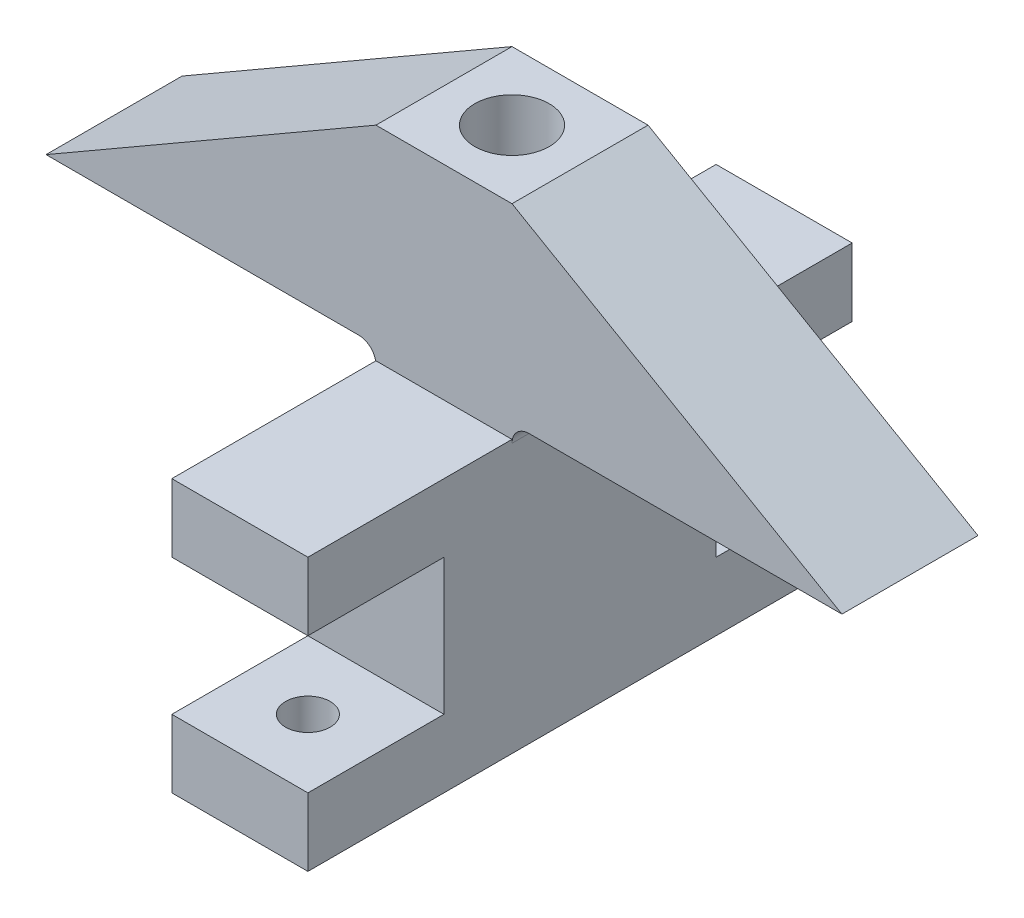
ISO-10303-21;
HEADER;
FILE_DESCRIPTION(('STEP AP214'),'2;1');
FILE_NAME('part.step','',(''),(''),'','','');
FILE_SCHEMA(('AUTOMOTIVE_DESIGN { 1 0 10303 214 1 1 1 1 }'));
ENDSEC;
DATA;
#1=APPLICATION_CONTEXT('core data for automotive mechanical design processes');
#2=APPLICATION_PROTOCOL_DEFINITION('international standard','automotive_design',2000,#1);
#3=PRODUCT_CONTEXT('',#1,'mechanical');
#4=PRODUCT('Part','Part','',(#3));
#5=PRODUCT_RELATED_PRODUCT_CATEGORY('part','',(#4));
#6=PRODUCT_DEFINITION_FORMATION('','',#4);
#7=PRODUCT_DEFINITION_CONTEXT('part definition',#1,'design');
#8=PRODUCT_DEFINITION('design','',#6,#7);
#9=PRODUCT_DEFINITION_SHAPE('','',#8);
#10=(LENGTH_UNIT() NAMED_UNIT(*) SI_UNIT(.MILLI.,.METRE.));
#11=(NAMED_UNIT(*) PLANE_ANGLE_UNIT() SI_UNIT($,.RADIAN.));
#12=(NAMED_UNIT(*) SI_UNIT($,.STERADIAN.) SOLID_ANGLE_UNIT());
#13=UNCERTAINTY_MEASURE_WITH_UNIT(LENGTH_MEASURE(1.E-05),#10,'distance_accuracy_value','');
#14=(GEOMETRIC_REPRESENTATION_CONTEXT(3) GLOBAL_UNCERTAINTY_ASSIGNED_CONTEXT((#13)) GLOBAL_UNIT_ASSIGNED_CONTEXT((#10,
#11,#12)) REPRESENTATION_CONTEXT('',''));
#15=CARTESIAN_POINT('',(0.,0.,0.));
#16=DIRECTION('',(0.,0.,1.));
#17=DIRECTION('',(1.,0.,0.));
#18=AXIS2_PLACEMENT_3D('',#15,#16,#17);
#19=CARTESIAN_POINT('',(0.,0.,0.));
#20=DIRECTION('',(0.,0.,-1.));
#21=DIRECTION('',(-1.,0.,0.));
#22=AXIS2_PLACEMENT_3D('',#19,#20,#21);
#23=PLANE('',#22);
#24=DIRECTION('',(-1.,0.,0.));
#25=VECTOR('',#24,1.);
#26=CARTESIAN_POINT('',(0.,50.8,0.));
#27=LINE('',#26,#25);
#28=CARTESIAN_POINT('',(25.4,50.8,0.));
#29=VERTEX_POINT('',#28);
#30=CARTESIAN_POINT('',(0.,50.8,0.));
#31=VERTEX_POINT('',#30);
#32=EDGE_CURVE('E59',#29,#31,#27,.T.);
#33=ORIENTED_EDGE('',*,*,#32,.T.);
#34=DIRECTION('',(0.,1.,0.));
#35=VECTOR('',#34,1.);
#36=CARTESIAN_POINT('',(0.,0.,0.));
#37=LINE('',#36,#35);
#38=CARTESIAN_POINT('',(0.,50.165,0.));
#39=VERTEX_POINT('',#38);
#40=EDGE_CURVE('E212',#39,#31,#37,.T.);
#41=ORIENTED_EDGE('',*,*,#40,.F.);
#42=CARTESIAN_POINT('',(-3.175,50.165,0.));
#43=DIRECTION('',(0.,0.,-1.));
#44=DIRECTION('',(-1.,0.,0.));
#45=AXIS2_PLACEMENT_3D('',#42,#43,#44);
#46=CIRCLE('',#45,3.175);
#47=CARTESIAN_POINT('',(-3.175,53.34,0.));
#48=VERTEX_POINT('',#47);
#49=EDGE_CURVE('E52',#39,#48,#46,.F.);
#50=ORIENTED_EDGE('',*,*,#49,.T.);
#51=DIRECTION('',(1.,0.,0.));
#52=VECTOR('',#51,1.);
#53=CARTESIAN_POINT('',(0.,53.34,0.));
#54=LINE('',#53,#52);
#55=CARTESIAN_POINT('',(-61.5917267171501,53.34,0.));
#56=VERTEX_POINT('',#55);
#57=EDGE_CURVE('E381',#56,#48,#54,.T.);
#58=ORIENTED_EDGE('',*,*,#57,.F.);
#59=DIRECTION('',(-0.866025403784441,-0.499999999999995,0.));
#60=VECTOR('',#59,1.);
#61=CARTESIAN_POINT('',(-61.5917267171501,53.34,0.));
#62=LINE('',#61,#60);
#63=CARTESIAN_POINT('',(0.,88.9,0.));
#64=VERTEX_POINT('',#63);
#65=EDGE_CURVE('E403',#64,#56,#62,.T.);
#66=ORIENTED_EDGE('',*,*,#65,.F.);
#67=DIRECTION('',(-1.,0.,0.));
#68=VECTOR('',#67,1.);
#69=CARTESIAN_POINT('',(0.,88.9,0.));
#70=LINE('',#69,#68);
#71=CARTESIAN_POINT('',(25.4,88.9,0.));
#72=VERTEX_POINT('',#71);
#73=EDGE_CURVE('E400',#72,#64,#70,.T.);
#74=ORIENTED_EDGE('',*,*,#73,.F.);
#75=DIRECTION('',(-0.866025403784442,0.499999999999995,0.));
#76=VECTOR('',#75,1.);
#77=CARTESIAN_POINT('',(25.4,88.9,0.));
#78=LINE('',#77,#76);
#79=CARTESIAN_POINT('',(86.9917267171501,53.34,0.));
#80=VERTEX_POINT('',#79);
#81=EDGE_CURVE('E397',#80,#72,#78,.T.);
#82=ORIENTED_EDGE('',*,*,#81,.F.);
#83=DIRECTION('',(1.,0.,0.));
#84=VECTOR('',#83,1.);
#85=CARTESIAN_POINT('',(86.9917267171501,53.34,0.));
#86=LINE('',#85,#84);
#87=CARTESIAN_POINT('',(28.575,53.34,0.));
#88=VERTEX_POINT('',#87);
#89=EDGE_CURVE('E376',#88,#80,#86,.T.);
#90=ORIENTED_EDGE('',*,*,#89,.F.);
#91=CARTESIAN_POINT('',(28.575,50.165,0.));
#92=DIRECTION('',(0.,0.,-1.));
#93=DIRECTION('',(-1.,0.,0.));
#94=AXIS2_PLACEMENT_3D('',#91,#92,#93);
#95=CIRCLE('',#94,3.175);
#96=CARTESIAN_POINT('',(25.4,50.165,0.));
#97=VERTEX_POINT('',#96);
#98=EDGE_CURVE('E444',#88,#97,#95,.F.);
#99=ORIENTED_EDGE('',*,*,#98,.T.);
#100=DIRECTION('',(0.,1.,0.));
#101=VECTOR('',#100,1.);
#102=CARTESIAN_POINT('',(25.4,0.,0.));
#103=LINE('',#102,#101);
#104=EDGE_CURVE('E64',#97,#29,#103,.T.);
#105=ORIENTED_EDGE('',*,*,#104,.T.);
#106=EDGE_LOOP('',(#33,#41,#50,#58,#66,#74,#82,#90,#99,#105));
#107=FACE_BOUND('',#106,.T.);
#108=ADVANCED_FACE('F43',(#107),#23,.T.);
#109=CARTESIAN_POINT('',(0.,0.,25.4));
#110=DIRECTION('',(0.,0.,-1.));
#111=DIRECTION('',(-1.,0.,0.));
#112=AXIS2_PLACEMENT_3D('',#109,#110,#111);
#113=PLANE('',#112);
#114=DIRECTION('',(0.,-1.,0.));
#115=VECTOR('',#114,1.);
#116=CARTESIAN_POINT('',(0.,0.,25.4));
#117=LINE('',#116,#115);
#118=CARTESIAN_POINT('',(0.,50.8,25.4));
#119=VERTEX_POINT('',#118);
#120=CARTESIAN_POINT('',(0.,50.165,25.4));
#121=VERTEX_POINT('',#120);
#122=EDGE_CURVE('E254',#119,#121,#117,.T.);
#123=ORIENTED_EDGE('',*,*,#122,.F.);
#124=DIRECTION('',(1.,0.,0.));
#125=VECTOR('',#124,1.);
#126=CARTESIAN_POINT('',(0.,50.8,25.4));
#127=LINE('',#126,#125);
#128=CARTESIAN_POINT('',(25.4,50.8,25.4));
#129=VERTEX_POINT('',#128);
#130=EDGE_CURVE('E260',#119,#129,#127,.T.);
#131=ORIENTED_EDGE('',*,*,#130,.T.);
#132=DIRECTION('',(0.,1.,0.));
#133=VECTOR('',#132,1.);
#134=CARTESIAN_POINT('',(25.4,0.,25.4));
#135=LINE('',#134,#133);
#136=CARTESIAN_POINT('',(25.4,50.165,25.4));
#137=VERTEX_POINT('',#136);
#138=EDGE_CURVE('E274',#137,#129,#135,.T.);
#139=ORIENTED_EDGE('',*,*,#138,.F.);
#140=CARTESIAN_POINT('',(28.575,50.165,25.4));
#141=DIRECTION('',(0.,0.,-1.));
#142=DIRECTION('',(-1.,0.,0.));
#143=AXIS2_PLACEMENT_3D('',#140,#141,#142);
#144=CIRCLE('',#143,3.175);
#145=CARTESIAN_POINT('',(28.575,53.34,25.4));
#146=VERTEX_POINT('',#145);
#147=EDGE_CURVE('E447',#137,#146,#144,.T.);
#148=ORIENTED_EDGE('',*,*,#147,.T.);
#149=DIRECTION('',(1.,0.,0.));
#150=VECTOR('',#149,1.);
#151=CARTESIAN_POINT('',(86.9917267171501,53.34,25.4));
#152=LINE('',#151,#150);
#153=CARTESIAN_POINT('',(86.9917267171501,53.34,25.4));
#154=VERTEX_POINT('',#153);
#155=EDGE_CURVE('E377',#146,#154,#152,.T.);
#156=ORIENTED_EDGE('',*,*,#155,.T.);
#157=DIRECTION('',(-0.866025403784442,0.499999999999995,0.));
#158=VECTOR('',#157,1.);
#159=CARTESIAN_POINT('',(25.4,88.9,25.4));
#160=LINE('',#159,#158);
#161=CARTESIAN_POINT('',(25.4,88.9,25.4));
#162=VERTEX_POINT('',#161);
#163=EDGE_CURVE('E380',#154,#162,#160,.T.);
#164=ORIENTED_EDGE('',*,*,#163,.T.);
#165=DIRECTION('',(-1.,0.,0.));
#166=VECTOR('',#165,1.);
#167=CARTESIAN_POINT('',(0.,88.9,25.4));
#168=LINE('',#167,#166);
#169=CARTESIAN_POINT('',(0.,88.9,25.4));
#170=VERTEX_POINT('',#169);
#171=EDGE_CURVE('E384',#162,#170,#168,.T.);
#172=ORIENTED_EDGE('',*,*,#171,.T.);
#173=DIRECTION('',(-0.866025403784441,-0.499999999999995,0.));
#174=VECTOR('',#173,1.);
#175=CARTESIAN_POINT('',(-61.5917267171501,53.34,25.4));
#176=LINE('',#175,#174);
#177=CARTESIAN_POINT('',(-61.5917267171501,53.34,25.4));
#178=VERTEX_POINT('',#177);
#179=EDGE_CURVE('E387',#170,#178,#176,.T.);
#180=ORIENTED_EDGE('',*,*,#179,.T.);
#181=DIRECTION('',(1.,0.,0.));
#182=VECTOR('',#181,1.);
#183=CARTESIAN_POINT('',(0.,53.34,25.4));
#184=LINE('',#183,#182);
#185=CARTESIAN_POINT('',(-3.175,53.34,25.4));
#186=VERTEX_POINT('',#185);
#187=EDGE_CURVE('E390',#178,#186,#184,.T.);
#188=ORIENTED_EDGE('',*,*,#187,.T.);
#189=CARTESIAN_POINT('',(-3.175,50.165,25.4));
#190=DIRECTION('',(0.,0.,-1.));
#191=DIRECTION('',(-1.,0.,0.));
#192=AXIS2_PLACEMENT_3D('',#189,#190,#191);
#193=CIRCLE('',#192,3.175);
#194=EDGE_CURVE('E11',#186,#121,#193,.T.);
#195=ORIENTED_EDGE('',*,*,#194,.T.);
#196=EDGE_LOOP('',(#123,#131,#139,#148,#156,#164,#172,#180,#188,#195));
#197=FACE_BOUND('',#196,.T.);
#198=ADVANCED_FACE('F462',(#197),#113,.F.);
#199=CARTESIAN_POINT('',(25.4,0.,25.4));
#200=DIRECTION('',(0.,1.,0.));
#201=DIRECTION('',(0.,0.,1.));
#202=AXIS2_PLACEMENT_3D('',#199,#200,#201);
#203=PLANE('',#202);
#204=CARTESIAN_POINT('',(12.7,0.,-25.4));
#205=DIRECTION('',(0.,1.,0.));
#206=DIRECTION('',(0.,0.,1.));
#207=AXIS2_PLACEMENT_3D('',#204,#205,#206);
#208=CIRCLE('',#207,4.1656);
#209=CARTESIAN_POINT('',(12.7,0.,-21.2344));
#210=VERTEX_POINT('',#209);
#211=EDGE_CURVE('E320',#210,#210,#208,.T.);
#212=ORIENTED_EDGE('',*,*,#211,.T.);
#213=EDGE_LOOP('',(#212));
#214=FACE_BOUND('',#213,.T.);
#215=CARTESIAN_POINT('',(12.7,0.,50.8));
#216=DIRECTION('',(0.,1.,0.));
#217=DIRECTION('',(0.,0.,1.));
#218=AXIS2_PLACEMENT_3D('',#215,#216,#217);
#219=CIRCLE('',#218,4.1656);
#220=CARTESIAN_POINT('',(12.7,0.,54.9656));
#221=VERTEX_POINT('',#220);
#222=EDGE_CURVE('E328',#221,#221,#219,.T.);
#223=ORIENTED_EDGE('',*,*,#222,.T.);
#224=EDGE_LOOP('',(#223));
#225=FACE_BOUND('',#224,.T.);
#226=DIRECTION('',(0.,0.,-1.));
#227=VECTOR('',#226,1.);
#228=CARTESIAN_POINT('',(0.,0.,25.4));
#229=LINE('',#228,#227);
#230=CARTESIAN_POINT('',(0.,0.,63.5));
#231=VERTEX_POINT('',#230);
#232=CARTESIAN_POINT('',(0.,0.,-38.1));
#233=VERTEX_POINT('',#232);
#234=EDGE_CURVE('E394',#231,#233,#229,.T.);
#235=ORIENTED_EDGE('',*,*,#234,.T.);
#236=DIRECTION('',(-1.,0.,0.));
#237=VECTOR('',#236,1.);
#238=CARTESIAN_POINT('',(25.4,0.,-38.1));
#239=LINE('',#238,#237);
#240=CARTESIAN_POINT('',(25.4,0.,-38.1));
#241=VERTEX_POINT('',#240);
#242=EDGE_CURVE('E336',#241,#233,#239,.T.);
#243=ORIENTED_EDGE('',*,*,#242,.F.);
#244=DIRECTION('',(0.,0.,-1.));
#245=VECTOR('',#244,1.);
#246=CARTESIAN_POINT('',(25.4,0.,25.4));
#247=LINE('',#246,#245);
#248=CARTESIAN_POINT('',(25.4,0.,63.5));
#249=VERTEX_POINT('',#248);
#250=EDGE_CURVE('E427',#249,#241,#247,.T.);
#251=ORIENTED_EDGE('',*,*,#250,.F.);
#252=DIRECTION('',(1.,0.,0.));
#253=VECTOR('',#252,1.);
#254=CARTESIAN_POINT('',(0.,0.,63.5));
#255=LINE('',#254,#253);
#256=EDGE_CURVE('E358',#231,#249,#255,.T.);
#257=ORIENTED_EDGE('',*,*,#256,.F.);
#258=EDGE_LOOP('',(#235,#243,#251,#257));
#259=FACE_BOUND('',#258,.T.);
#260=ADVANCED_FACE('F507',(#214,#225,#259),#203,.F.);
#261=CARTESIAN_POINT('',(25.4,53.34,25.4));
#262=DIRECTION('',(-1.,0.,0.));
#263=DIRECTION('',(0.,0.,1.));
#264=AXIS2_PLACEMENT_3D('',#261,#262,#263);
#265=PLANE('',#264);
#266=ORIENTED_EDGE('',*,*,#104,.F.);
#267=DIRECTION('',(0.,0.,-1.));
#268=VECTOR('',#267,1.);
#269=CARTESIAN_POINT('',(25.4,50.165,25.4));
#270=LINE('',#269,#268);
#271=EDGE_CURVE('E434',#97,#137,#270,.F.);
#272=ORIENTED_EDGE('',*,*,#271,.T.);
#273=ORIENTED_EDGE('',*,*,#138,.T.);
#274=DIRECTION('',(0.,0.,-1.));
#275=VECTOR('',#274,1.);
#276=CARTESIAN_POINT('',(25.4,50.8,63.5));
#277=LINE('',#276,#275);
#278=CARTESIAN_POINT('',(25.4,50.8,63.5));
#279=VERTEX_POINT('',#278);
#280=EDGE_CURVE('E283',#279,#129,#277,.T.);
#281=ORIENTED_EDGE('',*,*,#280,.F.);
#282=DIRECTION('',(0.,1.,0.));
#283=VECTOR('',#282,1.);
#284=CARTESIAN_POINT('',(25.4,0.,63.5));
#285=LINE('',#284,#283);
#286=CARTESIAN_POINT('',(25.4,38.1,63.5));
#287=VERTEX_POINT('',#286);
#288=EDGE_CURVE('E263',#287,#279,#285,.T.);
#289=ORIENTED_EDGE('',*,*,#288,.F.);
#290=DIRECTION('',(0.,0.,-1.));
#291=VECTOR('',#290,1.);
#292=CARTESIAN_POINT('',(25.4,38.1,63.5));
#293=LINE('',#292,#291);
#294=CARTESIAN_POINT('',(25.4,38.1,38.1));
#295=VERTEX_POINT('',#294);
#296=EDGE_CURVE('E287',#287,#295,#293,.T.);
#297=ORIENTED_EDGE('',*,*,#296,.T.);
#298=DIRECTION('',(0.,1.,0.));
#299=VECTOR('',#298,1.);
#300=CARTESIAN_POINT('',(25.4,0.,38.1));
#301=LINE('',#300,#299);
#302=CARTESIAN_POINT('',(25.4,12.7,38.1));
#303=VERTEX_POINT('',#302);
#304=EDGE_CURVE('E305',#303,#295,#301,.T.);
#305=ORIENTED_EDGE('',*,*,#304,.F.);
#306=DIRECTION('',(0.,0.,-1.));
#307=VECTOR('',#306,1.);
#308=CARTESIAN_POINT('',(25.4,12.7,63.5));
#309=LINE('',#308,#307);
#310=CARTESIAN_POINT('',(25.4,12.7,63.5));
#311=VERTEX_POINT('',#310);
#312=EDGE_CURVE('E372',#311,#303,#309,.T.);
#313=ORIENTED_EDGE('',*,*,#312,.F.);
#314=DIRECTION('',(0.,1.,0.));
#315=VECTOR('',#314,1.);
#316=CARTESIAN_POINT('',(25.4,0.,63.5));
#317=LINE('',#316,#315);
#318=EDGE_CURVE('E362',#249,#311,#317,.T.);
#319=ORIENTED_EDGE('',*,*,#318,.F.);
#320=ORIENTED_EDGE('',*,*,#250,.T.);
#321=DIRECTION('',(0.,-1.,0.));
#322=VECTOR('',#321,1.);
#323=CARTESIAN_POINT('',(25.4,0.,-38.1));
#324=LINE('',#323,#322);
#325=CARTESIAN_POINT('',(25.4,12.7,-38.1));
#326=VERTEX_POINT('',#325);
#327=EDGE_CURVE('E332',#326,#241,#324,.T.);
#328=ORIENTED_EDGE('',*,*,#327,.F.);
#329=DIRECTION('',(0.,0.,1.));
#330=VECTOR('',#329,1.);
#331=CARTESIAN_POINT('',(25.4,12.7,-38.1));
#332=LINE('',#331,#330);
#333=CARTESIAN_POINT('',(25.4,12.7,-12.7));
#334=VERTEX_POINT('',#333);
#335=EDGE_CURVE('E346',#326,#334,#332,.T.);
#336=ORIENTED_EDGE('',*,*,#335,.T.);
#337=DIRECTION('',(0.,-1.,0.));
#338=VECTOR('',#337,1.);
#339=CARTESIAN_POINT('',(25.4,0.,-12.7));
#340=LINE('',#339,#338);
#341=CARTESIAN_POINT('',(25.4,38.1,-12.7));
#342=VERTEX_POINT('',#341);
#343=EDGE_CURVE('E245',#342,#334,#340,.T.);
#344=ORIENTED_EDGE('',*,*,#343,.F.);
#345=DIRECTION('',(0.,0.,1.));
#346=VECTOR('',#345,1.);
#347=CARTESIAN_POINT('',(25.4,38.1,-38.1));
#348=LINE('',#347,#346);
#349=CARTESIAN_POINT('',(25.4,38.1,-38.1));
#350=VERTEX_POINT('',#349);
#351=EDGE_CURVE('E236',#350,#342,#348,.T.);
#352=ORIENTED_EDGE('',*,*,#351,.F.);
#353=DIRECTION('',(0.,1.,0.));
#354=VECTOR('',#353,1.);
#355=CARTESIAN_POINT('',(25.4,0.,-38.1));
#356=LINE('',#355,#354);
#357=CARTESIAN_POINT('',(25.4,50.8,-38.1));
#358=VERTEX_POINT('',#357);
#359=EDGE_CURVE('E220',#350,#358,#356,.T.);
#360=ORIENTED_EDGE('',*,*,#359,.T.);
#361=DIRECTION('',(0.,0.,1.));
#362=VECTOR('',#361,1.);
#363=CARTESIAN_POINT('',(25.4,50.8,-38.1));
#364=LINE('',#363,#362);
#365=EDGE_CURVE('E216',#358,#29,#364,.T.);
#366=ORIENTED_EDGE('',*,*,#365,.T.);
#367=EDGE_LOOP('',(#266,#272,#273,#281,#289,#297,#305,#313,#319,#320,#328,#336,#344,#352,#360,#366));
#368=FACE_BOUND('',#367,.T.);
#369=ADVANCED_FACE('F487',(#368),#265,.F.);
#370=CARTESIAN_POINT('',(86.9917267171501,53.34,25.4));
#371=DIRECTION('',(0.,1.,0.));
#372=DIRECTION('',(-1.,0.,0.));
#373=AXIS2_PLACEMENT_3D('',#370,#371,#372);
#374=PLANE('',#373);
#375=ORIENTED_EDGE('',*,*,#155,.F.);
#376=DIRECTION('',(0.,0.,-1.));
#377=VECTOR('',#376,1.);
#378=CARTESIAN_POINT('',(28.575,53.34,0.));
#379=LINE('',#378,#377);
#380=EDGE_CURVE('E430',#146,#88,#379,.T.);
#381=ORIENTED_EDGE('',*,*,#380,.T.);
#382=ORIENTED_EDGE('',*,*,#89,.T.);
#383=DIRECTION('',(0.,0.,-1.));
#384=VECTOR('',#383,1.);
#385=CARTESIAN_POINT('',(86.9917267171501,53.34,25.4));
#386=LINE('',#385,#384);
#387=EDGE_CURVE('E423',#154,#80,#386,.T.);
#388=ORIENTED_EDGE('',*,*,#387,.F.);
#389=EDGE_LOOP('',(#375,#381,#382,#388));
#390=FACE_BOUND('',#389,.T.);
#391=ADVANCED_FACE('F480',(#390),#374,.F.);
#392=CARTESIAN_POINT('',(25.4,88.9,25.4));
#393=DIRECTION('',(-0.499999999999995,-0.866025403784442,0.));
#394=DIRECTION('',(0.866025403784442,-0.499999999999995,0.));
#395=AXIS2_PLACEMENT_3D('',#392,#393,#394);
#396=PLANE('',#395);
#397=ORIENTED_EDGE('',*,*,#81,.T.);
#398=DIRECTION('',(0.,0.,-1.));
#399=VECTOR('',#398,1.);
#400=CARTESIAN_POINT('',(25.4,88.9,25.4));
#401=LINE('',#400,#399);
#402=EDGE_CURVE('E419',#162,#72,#401,.T.);
#403=ORIENTED_EDGE('',*,*,#402,.F.);
#404=ORIENTED_EDGE('',*,*,#163,.F.);
#405=ORIENTED_EDGE('',*,*,#387,.T.);
#406=EDGE_LOOP('',(#397,#403,#404,#405));
#407=FACE_BOUND('',#406,.T.);
#408=ADVANCED_FACE('F476',(#407),#396,.F.);
#409=CARTESIAN_POINT('',(0.,88.9,25.4));
#410=DIRECTION('',(0.,-1.,0.));
#411=DIRECTION('',(0.,0.,-1.));
#412=AXIS2_PLACEMENT_3D('',#409,#410,#411);
#413=PLANE('',#412);
#414=CARTESIAN_POINT('',(12.7,88.9,12.7));
#415=DIRECTION('',(0.,1.,0.));
#416=DIRECTION('',(0.,0.,1.));
#417=AXIS2_PLACEMENT_3D('',#414,#415,#416);
#418=CIRCLE('',#417,6.94689999999999);
#419=CARTESIAN_POINT('',(12.7,88.9,19.6469));
#420=VERTEX_POINT('',#419);
#421=EDGE_CURVE('E308',#420,#420,#418,.T.);
#422=ORIENTED_EDGE('',*,*,#421,.F.);
#423=EDGE_LOOP('',(#422));
#424=FACE_BOUND('',#423,.T.);
#425=ORIENTED_EDGE('',*,*,#73,.T.);
#426=DIRECTION('',(0.,0.,-1.));
#427=VECTOR('',#426,1.);
#428=CARTESIAN_POINT('',(0.,88.9,25.4));
#429=LINE('',#428,#427);
#430=EDGE_CURVE('E415',#170,#64,#429,.T.);
#431=ORIENTED_EDGE('',*,*,#430,.F.);
#432=ORIENTED_EDGE('',*,*,#171,.F.);
#433=ORIENTED_EDGE('',*,*,#402,.T.);
#434=EDGE_LOOP('',(#425,#431,#432,#433));
#435=FACE_BOUND('',#434,.T.);
#436=ADVANCED_FACE('F472',(#424,#435),#413,.F.);
#437=CARTESIAN_POINT('',(-61.5917267171501,53.34,25.4));
#438=DIRECTION('',(0.499999999999995,-0.866025403784441,0.));
#439=DIRECTION('',(0.866025403784442,0.499999999999995,0.));
#440=AXIS2_PLACEMENT_3D('',#437,#438,#439);
#441=PLANE('',#440);
#442=ORIENTED_EDGE('',*,*,#65,.T.);
#443=DIRECTION('',(0.,0.,-1.));
#444=VECTOR('',#443,1.);
#445=CARTESIAN_POINT('',(-61.5917267171501,53.34,25.4));
#446=LINE('',#445,#444);
#447=EDGE_CURVE('E411',#178,#56,#446,.T.);
#448=ORIENTED_EDGE('',*,*,#447,.F.);
#449=ORIENTED_EDGE('',*,*,#179,.F.);
#450=ORIENTED_EDGE('',*,*,#430,.T.);
#451=EDGE_LOOP('',(#442,#448,#449,#450));
#452=FACE_BOUND('',#451,.T.);
#453=ADVANCED_FACE('F467',(#452),#441,.F.);
#454=CARTESIAN_POINT('',(0.,53.34,25.4));
#455=DIRECTION('',(0.,1.,0.));
#456=DIRECTION('',(-1.,0.,0.));
#457=AXIS2_PLACEMENT_3D('',#454,#455,#456);
#458=PLANE('',#457);
#459=ORIENTED_EDGE('',*,*,#57,.T.);
#460=DIRECTION('',(0.,0.,-1.));
#461=VECTOR('',#460,1.);
#462=CARTESIAN_POINT('',(-3.175,53.34,25.4));
#463=LINE('',#462,#461);
#464=EDGE_CURVE('E441',#48,#186,#463,.F.);
#465=ORIENTED_EDGE('',*,*,#464,.T.);
#466=ORIENTED_EDGE('',*,*,#187,.F.);
#467=ORIENTED_EDGE('',*,*,#447,.T.);
#468=EDGE_LOOP('',(#459,#465,#466,#467));
#469=FACE_BOUND('',#468,.T.);
#470=ADVANCED_FACE('F457',(#469),#458,.F.);
#471=CARTESIAN_POINT('',(0.,0.,25.4));
#472=DIRECTION('',(1.,0.,0.));
#473=DIRECTION('',(0.,0.,-1.));
#474=AXIS2_PLACEMENT_3D('',#471,#472,#473);
#475=PLANE('',#474);
#476=DIRECTION('',(0.,0.,-1.));
#477=VECTOR('',#476,1.);
#478=CARTESIAN_POINT('',(0.,50.165,0.));
#479=LINE('',#478,#477);
#480=EDGE_CURVE('E438',#121,#39,#479,.T.);
#481=ORIENTED_EDGE('',*,*,#480,.T.);
#482=ORIENTED_EDGE('',*,*,#40,.T.);
#483=DIRECTION('',(0.,0.,1.));
#484=VECTOR('',#483,1.);
#485=CARTESIAN_POINT('',(0.,50.8,-38.1));
#486=LINE('',#485,#484);
#487=CARTESIAN_POINT('',(0.,50.8,-38.1));
#488=VERTEX_POINT('',#487);
#489=EDGE_CURVE('E209',#488,#31,#486,.T.);
#490=ORIENTED_EDGE('',*,*,#489,.F.);
#491=DIRECTION('',(0.,1.,0.));
#492=VECTOR('',#491,1.);
#493=CARTESIAN_POINT('',(0.,0.,-38.1));
#494=LINE('',#493,#492);
#495=CARTESIAN_POINT('',(0.,38.1,-38.1));
#496=VERTEX_POINT('',#495);
#497=EDGE_CURVE('E194',#496,#488,#494,.T.);
#498=ORIENTED_EDGE('',*,*,#497,.F.);
#499=DIRECTION('',(0.,0.,1.));
#500=VECTOR('',#499,1.);
#501=CARTESIAN_POINT('',(0.,38.1,-38.1));
#502=LINE('',#501,#500);
#503=CARTESIAN_POINT('',(0.,38.1,-12.7));
#504=VERTEX_POINT('',#503);
#505=EDGE_CURVE('E227',#496,#504,#502,.T.);
#506=ORIENTED_EDGE('',*,*,#505,.T.);
#507=DIRECTION('',(0.,1.,0.));
#508=VECTOR('',#507,1.);
#509=CARTESIAN_POINT('',(0.,0.,-12.7));
#510=LINE('',#509,#508);
#511=CARTESIAN_POINT('',(0.,12.7,-12.7));
#512=VERTEX_POINT('',#511);
#513=EDGE_CURVE('E251',#512,#504,#510,.T.);
#514=ORIENTED_EDGE('',*,*,#513,.F.);
#515=DIRECTION('',(0.,0.,1.));
#516=VECTOR('',#515,1.);
#517=CARTESIAN_POINT('',(0.,12.7,-38.1));
#518=LINE('',#517,#516);
#519=CARTESIAN_POINT('',(0.,12.7,-38.1));
#520=VERTEX_POINT('',#519);
#521=EDGE_CURVE('E350',#520,#512,#518,.T.);
#522=ORIENTED_EDGE('',*,*,#521,.F.);
#523=DIRECTION('',(0.,1.,0.));
#524=VECTOR('',#523,1.);
#525=CARTESIAN_POINT('',(0.,0.,-38.1));
#526=LINE('',#525,#524);
#527=EDGE_CURVE('E340',#233,#520,#526,.T.);
#528=ORIENTED_EDGE('',*,*,#527,.F.);
#529=ORIENTED_EDGE('',*,*,#234,.F.);
#530=DIRECTION('',(0.,-1.,0.));
#531=VECTOR('',#530,1.);
#532=CARTESIAN_POINT('',(0.,0.,63.5));
#533=LINE('',#532,#531);
#534=CARTESIAN_POINT('',(0.,12.7,63.5));
#535=VERTEX_POINT('',#534);
#536=EDGE_CURVE('E354',#535,#231,#533,.T.);
#537=ORIENTED_EDGE('',*,*,#536,.F.);
#538=DIRECTION('',(0.,0.,-1.));
#539=VECTOR('',#538,1.);
#540=CARTESIAN_POINT('',(0.,12.7,63.5));
#541=LINE('',#540,#539);
#542=CARTESIAN_POINT('',(0.,12.7,38.1));
#543=VERTEX_POINT('',#542);
#544=EDGE_CURVE('E368',#535,#543,#541,.T.);
#545=ORIENTED_EDGE('',*,*,#544,.T.);
#546=DIRECTION('',(0.,-1.,0.));
#547=VECTOR('',#546,1.);
#548=CARTESIAN_POINT('',(0.,0.,38.1));
#549=LINE('',#548,#547);
#550=CARTESIAN_POINT('',(0.,38.1,38.1));
#551=VERTEX_POINT('',#550);
#552=EDGE_CURVE('E299',#551,#543,#549,.T.);
#553=ORIENTED_EDGE('',*,*,#552,.F.);
#554=DIRECTION('',(0.,0.,-1.));
#555=VECTOR('',#554,1.);
#556=CARTESIAN_POINT('',(0.,38.1,63.5));
#557=LINE('',#556,#555);
#558=CARTESIAN_POINT('',(0.,38.1,63.5));
#559=VERTEX_POINT('',#558);
#560=EDGE_CURVE('E291',#559,#551,#557,.T.);
#561=ORIENTED_EDGE('',*,*,#560,.F.);
#562=DIRECTION('',(0.,-1.,0.));
#563=VECTOR('',#562,1.);
#564=CARTESIAN_POINT('',(0.,0.,63.5));
#565=LINE('',#564,#563);
#566=CARTESIAN_POINT('',(0.,50.8,63.5));
#567=VERTEX_POINT('',#566);
#568=EDGE_CURVE('E255',#567,#559,#565,.T.);
#569=ORIENTED_EDGE('',*,*,#568,.F.);
#570=DIRECTION('',(0.,0.,-1.));
#571=VECTOR('',#570,1.);
#572=CARTESIAN_POINT('',(0.,50.8,63.5));
#573=LINE('',#572,#571);
#574=EDGE_CURVE('E270',#567,#119,#573,.T.);
#575=ORIENTED_EDGE('',*,*,#574,.T.);
#576=ORIENTED_EDGE('',*,*,#122,.T.);
#577=EDGE_LOOP('',(#481,#482,#490,#498,#506,#514,#522,#528,#529,#537,#545,#553,#561,#569,#575,#576));
#578=FACE_BOUND('',#577,.T.);
#579=ADVANCED_FACE('F211',(#578),#475,.F.);
#580=CARTESIAN_POINT('',(0.,12.7,63.5));
#581=DIRECTION('',(0.,-1.,0.));
#582=DIRECTION('',(0.,0.,-1.));
#583=AXIS2_PLACEMENT_3D('',#580,#581,#582);
#584=PLANE('',#583);
#585=CARTESIAN_POINT('',(12.7,12.7,50.8));
#586=DIRECTION('',(0.,1.,0.));
#587=DIRECTION('',(0.,0.,1.));
#588=AXIS2_PLACEMENT_3D('',#585,#586,#587);
#589=CIRCLE('',#588,4.1656);
#590=CARTESIAN_POINT('',(12.7,12.7,54.9656));
#591=VERTEX_POINT('',#590);
#592=EDGE_CURVE('E324',#591,#591,#589,.T.);
#593=ORIENTED_EDGE('',*,*,#592,.F.);
#594=EDGE_LOOP('',(#593));
#595=FACE_BOUND('',#594,.T.);
#596=ORIENTED_EDGE('',*,*,#312,.T.);
#597=DIRECTION('',(1.,0.,0.));
#598=VECTOR('',#597,1.);
#599=CARTESIAN_POINT('',(0.,12.7,38.1));
#600=LINE('',#599,#598);
#601=EDGE_CURVE('E302',#543,#303,#600,.T.);
#602=ORIENTED_EDGE('',*,*,#601,.F.);
#603=ORIENTED_EDGE('',*,*,#544,.F.);
#604=DIRECTION('',(-1.,0.,0.));
#605=VECTOR('',#604,1.);
#606=CARTESIAN_POINT('',(0.,12.7,63.5));
#607=LINE('',#606,#605);
#608=EDGE_CURVE('E365',#311,#535,#607,.T.);
#609=ORIENTED_EDGE('',*,*,#608,.F.);
#610=EDGE_LOOP('',(#596,#602,#603,#609));
#611=FACE_BOUND('',#610,.T.);
#612=ADVANCED_FACE('F516',(#595,#611),#584,.F.);
#613=CARTESIAN_POINT('',(0.,0.,63.5));
#614=DIRECTION('',(0.,0.,-1.));
#615=DIRECTION('',(-1.,0.,0.));
#616=AXIS2_PLACEMENT_3D('',#613,#614,#615);
#617=PLANE('',#616);
#618=ORIENTED_EDGE('',*,*,#536,.T.);
#619=ORIENTED_EDGE('',*,*,#256,.T.);
#620=ORIENTED_EDGE('',*,*,#318,.T.);
#621=ORIENTED_EDGE('',*,*,#608,.T.);
#622=EDGE_LOOP('',(#618,#619,#620,#621));
#623=FACE_BOUND('',#622,.T.);
#624=ADVANCED_FACE('F510',(#623),#617,.F.);
#625=CARTESIAN_POINT('',(25.4,12.7,-38.1));
#626=DIRECTION('',(0.,-1.,0.));
#627=DIRECTION('',(0.,0.,-1.));
#628=AXIS2_PLACEMENT_3D('',#625,#626,#627);
#629=PLANE('',#628);
#630=CARTESIAN_POINT('',(12.7,12.7,-25.4));
#631=DIRECTION('',(0.,1.,0.));
#632=DIRECTION('',(0.,0.,1.));
#633=AXIS2_PLACEMENT_3D('',#630,#631,#632);
#634=CIRCLE('',#633,4.1656);
#635=CARTESIAN_POINT('',(12.7,12.7,-21.2344));
#636=VERTEX_POINT('',#635);
#637=EDGE_CURVE('E316',#636,#636,#634,.T.);
#638=ORIENTED_EDGE('',*,*,#637,.F.);
#639=EDGE_LOOP('',(#638));
#640=FACE_BOUND('',#639,.T.);
#641=ORIENTED_EDGE('',*,*,#521,.T.);
#642=DIRECTION('',(-1.,0.,0.));
#643=VECTOR('',#642,1.);
#644=CARTESIAN_POINT('',(0.,12.7,-12.7));
#645=LINE('',#644,#643);
#646=EDGE_CURVE('E248',#334,#512,#645,.T.);
#647=ORIENTED_EDGE('',*,*,#646,.F.);
#648=ORIENTED_EDGE('',*,*,#335,.F.);
#649=DIRECTION('',(1.,0.,0.));
#650=VECTOR('',#649,1.);
#651=CARTESIAN_POINT('',(25.4,12.7,-38.1));
#652=LINE('',#651,#650);
#653=EDGE_CURVE('E343',#520,#326,#652,.T.);
#654=ORIENTED_EDGE('',*,*,#653,.F.);
#655=EDGE_LOOP('',(#641,#647,#648,#654));
#656=FACE_BOUND('',#655,.T.);
#657=ADVANCED_FACE('F498',(#640,#656),#629,.F.);
#658=CARTESIAN_POINT('',(0.,0.,-38.1));
#659=DIRECTION('',(0.,0.,1.));
#660=DIRECTION('',(1.,0.,0.));
#661=AXIS2_PLACEMENT_3D('',#658,#659,#660);
#662=PLANE('',#661);
#663=ORIENTED_EDGE('',*,*,#327,.T.);
#664=ORIENTED_EDGE('',*,*,#242,.T.);
#665=ORIENTED_EDGE('',*,*,#527,.T.);
#666=ORIENTED_EDGE('',*,*,#653,.T.);
#667=EDGE_LOOP('',(#663,#664,#665,#666));
#668=FACE_BOUND('',#667,.T.);
#669=ADVANCED_FACE('F502',(#668),#662,.F.);
#670=CARTESIAN_POINT('',(12.7,12.7,50.8));
#671=DIRECTION('',(0.,1.,0.));
#672=DIRECTION('',(0.,0.,1.));
#673=AXIS2_PLACEMENT_3D('',#670,#671,#672);
#674=CYLINDRICAL_SURFACE('',#673,4.1656);
#675=ORIENTED_EDGE('',*,*,#222,.F.);
#676=EDGE_LOOP('',(#675));
#677=FACE_BOUND('',#676,.T.);
#678=ORIENTED_EDGE('',*,*,#592,.T.);
#679=EDGE_LOOP('',(#678));
#680=FACE_BOUND('',#679,.T.);
#681=ADVANCED_FACE('F589',(#677,#680),#674,.F.);
#682=CARTESIAN_POINT('',(12.7,12.7,-25.4));
#683=DIRECTION('',(0.,1.,0.));
#684=DIRECTION('',(0.,0.,1.));
#685=AXIS2_PLACEMENT_3D('',#682,#683,#684);
#686=CYLINDRICAL_SURFACE('',#685,4.1656);
#687=ORIENTED_EDGE('',*,*,#211,.F.);
#688=EDGE_LOOP('',(#687));
#689=FACE_BOUND('',#688,.T.);
#690=ORIENTED_EDGE('',*,*,#637,.T.);
#691=EDGE_LOOP('',(#690));
#692=FACE_BOUND('',#691,.T.);
#693=ADVANCED_FACE('F580',(#689,#692),#686,.F.);
#694=CARTESIAN_POINT('',(12.7,53.848,12.7));
#695=DIRECTION('',(0.,1.,0.));
#696=DIRECTION('',(0.,0.,1.));
#697=AXIS2_PLACEMENT_3D('',#694,#695,#696);
#698=CONICAL_SURFACE('',#697,6.94689999999999,1.02974425867665);
#699=CARTESIAN_POINT('',(12.7,49.6738813656774,12.7));
#700=VERTEX_POINT('',#699);
#701=VERTEX_LOOP('',#700);
#702=FACE_BOUND('',#701,.T.);
#703=CARTESIAN_POINT('',(12.7,53.848,12.7));
#704=DIRECTION('',(0.,1.,0.));
#705=DIRECTION('',(0.,0.,1.));
#706=AXIS2_PLACEMENT_3D('',#703,#704,#705);
#707=CIRCLE('',#706,6.94689999999999);
#708=CARTESIAN_POINT('',(12.7,53.848,19.6469));
#709=VERTEX_POINT('',#708);
#710=EDGE_CURVE('E312',#709,#709,#707,.T.);
#711=ORIENTED_EDGE('',*,*,#710,.T.);
#712=EDGE_LOOP('',(#711));
#713=FACE_BOUND('',#712,.T.);
#714=ADVANCED_FACE('F574',(#702,#713),#698,.F.);
#715=CARTESIAN_POINT('',(12.7,88.9,12.7));
#716=DIRECTION('',(0.,1.,0.));
#717=DIRECTION('',(0.,0.,1.));
#718=AXIS2_PLACEMENT_3D('',#715,#716,#717);
#719=CYLINDRICAL_SURFACE('',#718,6.94689999999999);
#720=ORIENTED_EDGE('',*,*,#710,.F.);
#721=EDGE_LOOP('',(#720));
#722=FACE_BOUND('',#721,.T.);
#723=ORIENTED_EDGE('',*,*,#421,.T.);
#724=EDGE_LOOP('',(#723));
#725=FACE_BOUND('',#724,.T.);
#726=ADVANCED_FACE('F569',(#722,#725),#719,.F.);
#727=CARTESIAN_POINT('',(28.575,50.165,25.4));
#728=DIRECTION('',(0.,0.,1.));
#729=DIRECTION('',(1.,0.,0.));
#730=AXIS2_PLACEMENT_3D('',#727,#728,#729);
#731=CYLINDRICAL_SURFACE('',#730,3.175);
#732=ORIENTED_EDGE('',*,*,#147,.F.);
#733=ORIENTED_EDGE('',*,*,#271,.F.);
#734=ORIENTED_EDGE('',*,*,#98,.F.);
#735=ORIENTED_EDGE('',*,*,#380,.F.);
#736=EDGE_LOOP('',(#732,#733,#734,#735));
#737=FACE_BOUND('',#736,.T.);
#738=ADVANCED_FACE('F485',(#737),#731,.F.);
#739=CARTESIAN_POINT('',(-3.175,50.165,25.4));
#740=DIRECTION('',(0.,0.,1.));
#741=DIRECTION('',(1.,0.,0.));
#742=AXIS2_PLACEMENT_3D('',#739,#740,#741);
#743=CYLINDRICAL_SURFACE('',#742,3.175);
#744=ORIENTED_EDGE('',*,*,#194,.F.);
#745=ORIENTED_EDGE('',*,*,#464,.F.);
#746=ORIENTED_EDGE('',*,*,#49,.F.);
#747=ORIENTED_EDGE('',*,*,#480,.F.);
#748=EDGE_LOOP('',(#744,#745,#746,#747));
#749=FACE_BOUND('',#748,.T.);
#750=ADVANCED_FACE('F45',(#749),#743,.F.);
#751=CARTESIAN_POINT('',(0.,0.,38.1));
#752=DIRECTION('',(0.,0.,1.));
#753=DIRECTION('',(1.,0.,0.));
#754=AXIS2_PLACEMENT_3D('',#751,#752,#753);
#755=PLANE('',#754);
#756=DIRECTION('',(1.,0.,0.));
#757=VECTOR('',#756,1.);
#758=CARTESIAN_POINT('',(0.,38.1,38.1));
#759=LINE('',#758,#757);
#760=EDGE_CURVE('E295',#551,#295,#759,.T.);
#761=ORIENTED_EDGE('',*,*,#760,.F.);
#762=ORIENTED_EDGE('',*,*,#552,.T.);
#763=ORIENTED_EDGE('',*,*,#601,.T.);
#764=ORIENTED_EDGE('',*,*,#304,.T.);
#765=EDGE_LOOP('',(#761,#762,#763,#764));
#766=FACE_BOUND('',#765,.T.);
#767=ADVANCED_FACE('F521',(#766),#755,.T.);
#768=CARTESIAN_POINT('',(0.,38.1,63.5));
#769=DIRECTION('',(0.,1.,0.));
#770=DIRECTION('',(0.,0.,1.));
#771=AXIS2_PLACEMENT_3D('',#768,#769,#770);
#772=PLANE('',#771);
#773=ORIENTED_EDGE('',*,*,#760,.T.);
#774=ORIENTED_EDGE('',*,*,#296,.F.);
#775=DIRECTION('',(1.,0.,0.));
#776=VECTOR('',#775,1.);
#777=CARTESIAN_POINT('',(0.,38.1,63.5));
#778=LINE('',#777,#776);
#779=EDGE_CURVE('E259',#559,#287,#778,.T.);
#780=ORIENTED_EDGE('',*,*,#779,.F.);
#781=ORIENTED_EDGE('',*,*,#560,.T.);
#782=EDGE_LOOP('',(#773,#774,#780,#781));
#783=FACE_BOUND('',#782,.T.);
#784=ADVANCED_FACE('F525',(#783),#772,.F.);
#785=CARTESIAN_POINT('',(0.,50.8,63.5));
#786=DIRECTION('',(0.,1.,0.));
#787=DIRECTION('',(0.,0.,1.));
#788=AXIS2_PLACEMENT_3D('',#785,#786,#787);
#789=PLANE('',#788);
#790=ORIENTED_EDGE('',*,*,#130,.F.);
#791=ORIENTED_EDGE('',*,*,#574,.F.);
#792=DIRECTION('',(1.,0.,0.));
#793=VECTOR('',#792,1.);
#794=CARTESIAN_POINT('',(0.,50.8,63.5));
#795=LINE('',#794,#793);
#796=EDGE_CURVE('E266',#567,#279,#795,.T.);
#797=ORIENTED_EDGE('',*,*,#796,.T.);
#798=ORIENTED_EDGE('',*,*,#280,.T.);
#799=EDGE_LOOP('',(#790,#791,#797,#798));
#800=FACE_BOUND('',#799,.T.);
#801=ADVANCED_FACE('F532',(#800),#789,.T.);
#802=CARTESIAN_POINT('',(0.,0.,63.5));
#803=DIRECTION('',(0.,0.,1.));
#804=DIRECTION('',(1.,0.,0.));
#805=AXIS2_PLACEMENT_3D('',#802,#803,#804);
#806=PLANE('',#805);
#807=ORIENTED_EDGE('',*,*,#568,.T.);
#808=ORIENTED_EDGE('',*,*,#779,.T.);
#809=ORIENTED_EDGE('',*,*,#288,.T.);
#810=ORIENTED_EDGE('',*,*,#796,.F.);
#811=EDGE_LOOP('',(#807,#808,#809,#810));
#812=FACE_BOUND('',#811,.T.);
#813=ADVANCED_FACE('F529',(#812),#806,.T.);
#814=CARTESIAN_POINT('',(0.,0.,-12.7));
#815=DIRECTION('',(0.,0.,-1.));
#816=DIRECTION('',(-1.,0.,0.));
#817=AXIS2_PLACEMENT_3D('',#814,#815,#816);
#818=PLANE('',#817);
#819=DIRECTION('',(-1.,0.,0.));
#820=VECTOR('',#819,1.);
#821=CARTESIAN_POINT('',(0.,38.1,-12.7));
#822=LINE('',#821,#820);
#823=EDGE_CURVE('E215',#342,#504,#822,.T.);
#824=ORIENTED_EDGE('',*,*,#823,.F.);
#825=ORIENTED_EDGE('',*,*,#343,.T.);
#826=ORIENTED_EDGE('',*,*,#646,.T.);
#827=ORIENTED_EDGE('',*,*,#513,.T.);
#828=EDGE_LOOP('',(#824,#825,#826,#827));
#829=FACE_BOUND('',#828,.T.);
#830=ADVANCED_FACE('F540',(#829),#818,.T.);
#831=CARTESIAN_POINT('',(0.,50.8,-38.1));
#832=DIRECTION('',(0.,1.,0.));
#833=DIRECTION('',(0.,0.,1.));
#834=AXIS2_PLACEMENT_3D('',#831,#832,#833);
#835=PLANE('',#834);
#836=ORIENTED_EDGE('',*,*,#32,.F.);
#837=ORIENTED_EDGE('',*,*,#365,.F.);
#838=DIRECTION('',(-1.,0.,0.));
#839=VECTOR('',#838,1.);
#840=CARTESIAN_POINT('',(0.,50.8,-38.1));
#841=LINE('',#840,#839);
#842=EDGE_CURVE('E199',#358,#488,#841,.T.);
#843=ORIENTED_EDGE('',*,*,#842,.T.);
#844=ORIENTED_EDGE('',*,*,#489,.T.);
#845=EDGE_LOOP('',(#836,#837,#843,#844));
#846=FACE_BOUND('',#845,.T.);
#847=ADVANCED_FACE('F218',(#846),#835,.T.);
#848=CARTESIAN_POINT('',(0.,38.1,-38.1));
#849=DIRECTION('',(0.,1.,0.));
#850=DIRECTION('',(0.,0.,1.));
#851=AXIS2_PLACEMENT_3D('',#848,#849,#850);
#852=PLANE('',#851);
#853=ORIENTED_EDGE('',*,*,#823,.T.);
#854=ORIENTED_EDGE('',*,*,#505,.F.);
#855=DIRECTION('',(-1.,0.,0.));
#856=VECTOR('',#855,1.);
#857=CARTESIAN_POINT('',(0.,38.1,-38.1));
#858=LINE('',#857,#856);
#859=EDGE_CURVE('E202',#350,#496,#858,.T.);
#860=ORIENTED_EDGE('',*,*,#859,.F.);
#861=ORIENTED_EDGE('',*,*,#351,.T.);
#862=EDGE_LOOP('',(#853,#854,#860,#861));
#863=FACE_BOUND('',#862,.T.);
#864=ADVANCED_FACE('F490',(#863),#852,.F.);
#865=CARTESIAN_POINT('',(0.,0.,-38.1));
#866=DIRECTION('',(0.,0.,-1.));
#867=DIRECTION('',(-1.,0.,0.));
#868=AXIS2_PLACEMENT_3D('',#865,#866,#867);
#869=PLANE('',#868);
#870=ORIENTED_EDGE('',*,*,#497,.T.);
#871=ORIENTED_EDGE('',*,*,#842,.F.);
#872=ORIENTED_EDGE('',*,*,#359,.F.);
#873=ORIENTED_EDGE('',*,*,#859,.T.);
#874=EDGE_LOOP('',(#870,#871,#872,#873));
#875=FACE_BOUND('',#874,.T.);
#876=ADVANCED_FACE('F196',(#875),#869,.T.);
#877=CLOSED_SHELL('',(#108,#198,#260,#369,#391,#408,#436,#453,#470,#579,#612,#624,#657,#669,
#681,#693,#714,#726,#738,#750,#767,#784,#801,#813,#830,#847,#864,#876));
#878=MANIFOLD_SOLID_BREP('B2',#877);
#879=ADVANCED_BREP_SHAPE_REPRESENTATION('',(#18,#878),#14);
#880=SHAPE_DEFINITION_REPRESENTATION(#9,#879);
ENDSEC;
END-ISO-10303-21;
